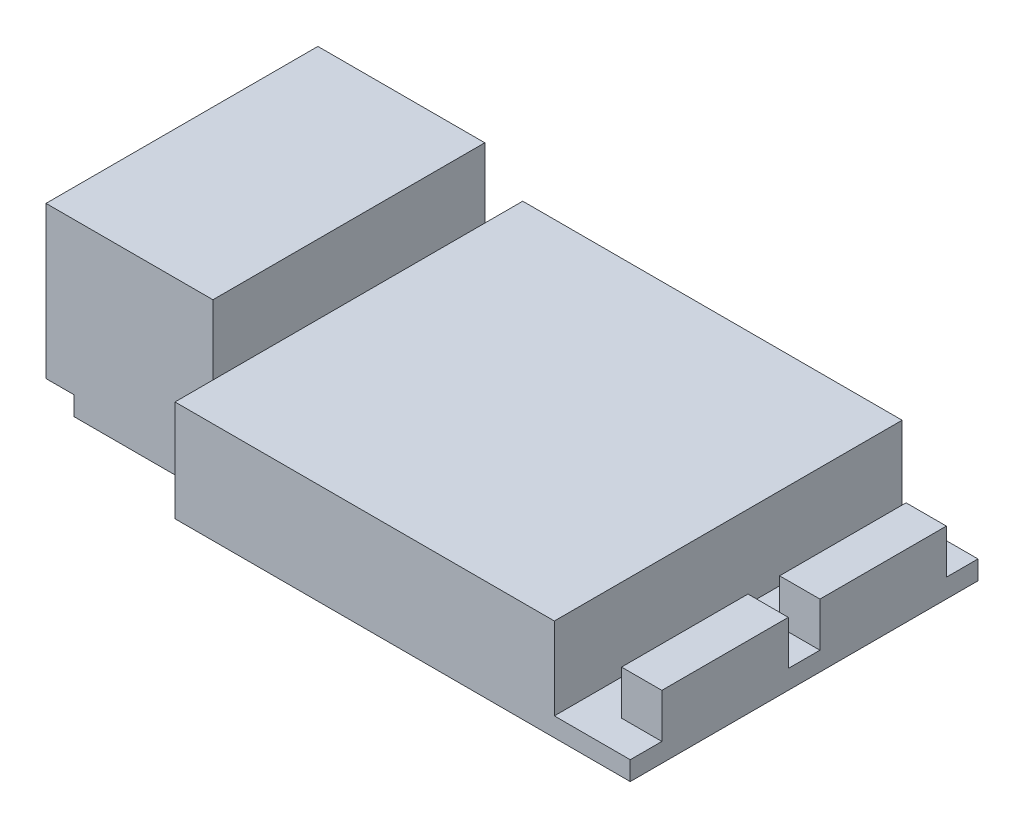
ISO-10303-21;
HEADER;
FILE_DESCRIPTION(('STEP AP214'),'2;1');
FILE_NAME('part.step','',(''),(''),'','','');
FILE_SCHEMA(('AUTOMOTIVE_DESIGN { 1 0 10303 214 1 1 1 1 }'));
ENDSEC;
DATA;
#1=APPLICATION_CONTEXT('core data for automotive mechanical design processes');
#2=APPLICATION_PROTOCOL_DEFINITION('international standard','automotive_design',2000,#1);
#3=PRODUCT_CONTEXT('',#1,'mechanical');
#4=PRODUCT('Part','Part','',(#3));
#5=PRODUCT_RELATED_PRODUCT_CATEGORY('part','',(#4));
#6=PRODUCT_DEFINITION_FORMATION('','',#4);
#7=PRODUCT_DEFINITION_CONTEXT('part definition',#1,'design');
#8=PRODUCT_DEFINITION('design','',#6,#7);
#9=PRODUCT_DEFINITION_SHAPE('','',#8);
#10=(LENGTH_UNIT() NAMED_UNIT(*) SI_UNIT(.MILLI.,.METRE.));
#11=(NAMED_UNIT(*) PLANE_ANGLE_UNIT() SI_UNIT($,.RADIAN.));
#12=(NAMED_UNIT(*) SI_UNIT($,.STERADIAN.) SOLID_ANGLE_UNIT());
#13=UNCERTAINTY_MEASURE_WITH_UNIT(LENGTH_MEASURE(1.E-05),#10,'distance_accuracy_value','');
#14=(GEOMETRIC_REPRESENTATION_CONTEXT(3) GLOBAL_UNCERTAINTY_ASSIGNED_CONTEXT((#13)) GLOBAL_UNIT_ASSIGNED_CONTEXT((#10,
#11,#12)) REPRESENTATION_CONTEXT('',''));
#15=CARTESIAN_POINT('',(0.,0.,0.));
#16=DIRECTION('',(0.,0.,1.));
#17=DIRECTION('',(1.,0.,0.));
#18=AXIS2_PLACEMENT_3D('',#15,#16,#17);
#19=CARTESIAN_POINT('',(0.,1.5,0.));
#20=DIRECTION('',(0.,-1.,0.));
#21=DIRECTION('',(0.,0.,-1.));
#22=AXIS2_PLACEMENT_3D('',#19,#20,#21);
#23=PLANE('',#22);
#24=DIRECTION('',(1.,0.,0.));
#25=VECTOR('',#24,1.);
#26=CARTESIAN_POINT('',(20.3115134769722,1.5,11.25));
#27=LINE('',#26,#25);
#28=CARTESIAN_POINT('',(20.3115134769722,1.5,11.25));
#29=VERTEX_POINT('',#28);
#30=CARTESIAN_POINT('',(23.5,1.5,11.25));
#31=VERTEX_POINT('',#30);
#32=EDGE_CURVE('E61',#29,#31,#27,.T.);
#33=ORIENTED_EDGE('',*,*,#32,.F.);
#34=DIRECTION('',(0.,0.,1.));
#35=VECTOR('',#34,1.);
#36=CARTESIAN_POINT('',(20.3115134769722,1.5,11.25));
#37=LINE('',#36,#35);
#38=CARTESIAN_POINT('',(20.3115134769722,1.5,1.25));
#39=VERTEX_POINT('',#38);
#40=EDGE_CURVE('E66',#39,#29,#37,.T.);
#41=ORIENTED_EDGE('',*,*,#40,.F.);
#42=DIRECTION('',(-1.,0.,0.));
#43=VECTOR('',#42,1.);
#44=CARTESIAN_POINT('',(20.3115134769722,1.5,1.25));
#45=LINE('',#44,#43);
#46=CARTESIAN_POINT('',(23.5,1.5,1.25));
#47=VERTEX_POINT('',#46);
#48=EDGE_CURVE('E203',#47,#39,#45,.T.);
#49=ORIENTED_EDGE('',*,*,#48,.F.);
#50=DIRECTION('',(0.,0.,-1.));
#51=VECTOR('',#50,1.);
#52=CARTESIAN_POINT('',(23.5,1.5,13.75));
#53=LINE('',#52,#51);
#54=CARTESIAN_POINT('',(23.5,1.5,-1.25));
#55=VERTEX_POINT('',#54);
#56=EDGE_CURVE('E188',#47,#55,#53,.T.);
#57=ORIENTED_EDGE('',*,*,#56,.T.);
#58=DIRECTION('',(1.,0.,0.));
#59=VECTOR('',#58,1.);
#60=CARTESIAN_POINT('',(20.3115134769722,1.5,-1.25));
#61=LINE('',#60,#59);
#62=CARTESIAN_POINT('',(20.3115134769722,1.5,-1.25));
#63=VERTEX_POINT('',#62);
#64=EDGE_CURVE('E258',#63,#55,#61,.T.);
#65=ORIENTED_EDGE('',*,*,#64,.F.);
#66=DIRECTION('',(0.,0.,1.));
#67=VECTOR('',#66,1.);
#68=CARTESIAN_POINT('',(20.3115134769722,1.5,-11.25));
#69=LINE('',#68,#67);
#70=CARTESIAN_POINT('',(20.3115134769722,1.5,-11.25));
#71=VERTEX_POINT('',#70);
#72=EDGE_CURVE('E228',#71,#63,#69,.T.);
#73=ORIENTED_EDGE('',*,*,#72,.F.);
#74=DIRECTION('',(-1.,0.,0.));
#75=VECTOR('',#74,1.);
#76=CARTESIAN_POINT('',(20.3115134769722,1.5,-11.25));
#77=LINE('',#76,#75);
#78=CARTESIAN_POINT('',(23.5,1.5,-11.25));
#79=VERTEX_POINT('',#78);
#80=EDGE_CURVE('E245',#79,#71,#77,.T.);
#81=ORIENTED_EDGE('',*,*,#80,.F.);
#82=CARTESIAN_POINT('',(23.5,1.5,-13.75));
#83=VERTEX_POINT('',#82);
#84=EDGE_CURVE('E201',#79,#83,#53,.T.);
#85=ORIENTED_EDGE('',*,*,#84,.T.);
#86=DIRECTION('',(1.,0.,0.));
#87=VECTOR('',#86,1.);
#88=CARTESIAN_POINT('',(-12.5,1.5,-13.75));
#89=LINE('',#88,#87);
#90=CARTESIAN_POINT('',(17.5,1.5,-13.75));
#91=VERTEX_POINT('',#90);
#92=EDGE_CURVE('E345',#91,#83,#89,.T.);
#93=ORIENTED_EDGE('',*,*,#92,.F.);
#94=DIRECTION('',(0.,0.,-1.));
#95=VECTOR('',#94,1.);
#96=CARTESIAN_POINT('',(17.5,1.5,-13.75));
#97=LINE('',#96,#95);
#98=CARTESIAN_POINT('',(17.5,1.5,13.75));
#99=VERTEX_POINT('',#98);
#100=EDGE_CURVE('E316',#99,#91,#97,.T.);
#101=ORIENTED_EDGE('',*,*,#100,.F.);
#102=DIRECTION('',(1.,0.,0.));
#103=VECTOR('',#102,1.);
#104=CARTESIAN_POINT('',(-12.5,1.5,13.75));
#105=LINE('',#104,#103);
#106=CARTESIAN_POINT('',(23.5,1.5,13.75));
#107=VERTEX_POINT('',#106);
#108=EDGE_CURVE('E351',#99,#107,#105,.T.);
#109=ORIENTED_EDGE('',*,*,#108,.T.);
#110=EDGE_CURVE('E200',#107,#31,#53,.T.);
#111=ORIENTED_EDGE('',*,*,#110,.T.);
#112=EDGE_LOOP('',(#33,#41,#49,#57,#65,#73,#81,#85,#93,#101,#109,#111));
#113=FACE_BOUND('',#112,.T.);
#114=ADVANCED_FACE('F43',(#113),#23,.F.);
#115=CARTESIAN_POINT('',(-12.5,1.5,10.75));
#116=DIRECTION('',(1.,0.,0.));
#117=DIRECTION('',(0.,0.,-1.));
#118=AXIS2_PLACEMENT_3D('',#115,#116,#117);
#119=PLANE('',#118);
#120=DIRECTION('',(0.,-1.,0.));
#121=VECTOR('',#120,1.);
#122=CARTESIAN_POINT('',(-12.5,1.5,-10.75));
#123=LINE('',#122,#121);
#124=CARTESIAN_POINT('',(-12.5,8.,-10.75));
#125=VERTEX_POINT('',#124);
#126=CARTESIAN_POINT('',(-12.5,0.,-10.75));
#127=VERTEX_POINT('',#126);
#128=EDGE_CURVE('E11',#125,#127,#123,.T.);
#129=ORIENTED_EDGE('',*,*,#128,.F.);
#130=DIRECTION('',(0.,0.,1.));
#131=VECTOR('',#130,1.);
#132=CARTESIAN_POINT('',(-12.5,8.,-13.75));
#133=LINE('',#132,#131);
#134=CARTESIAN_POINT('',(-12.5,8.,-13.75));
#135=VERTEX_POINT('',#134);
#136=EDGE_CURVE('E317',#135,#125,#133,.T.);
#137=ORIENTED_EDGE('',*,*,#136,.F.);
#138=DIRECTION('',(0.,-1.,0.));
#139=VECTOR('',#138,1.);
#140=CARTESIAN_POINT('',(-12.5,1.5,-13.75));
#141=LINE('',#140,#139);
#142=CARTESIAN_POINT('',(-12.5,0.,-13.75));
#143=VERTEX_POINT('',#142);
#144=EDGE_CURVE('E47',#135,#143,#141,.T.);
#145=ORIENTED_EDGE('',*,*,#144,.T.);
#146=DIRECTION('',(0.,0.,-1.));
#147=VECTOR('',#146,1.);
#148=CARTESIAN_POINT('',(-12.5,0.,-10.75));
#149=LINE('',#148,#147);
#150=EDGE_CURVE('E344',#127,#143,#149,.T.);
#151=ORIENTED_EDGE('',*,*,#150,.F.);
#152=EDGE_LOOP('',(#129,#137,#145,#151));
#153=FACE_BOUND('',#152,.T.);
#154=ADVANCED_FACE('F409',(#153),#119,.F.);
#155=CARTESIAN_POINT('',(-12.5,8.,10.75));
#156=VERTEX_POINT('',#155);
#157=CARTESIAN_POINT('',(-12.5,8.,13.75));
#158=VERTEX_POINT('',#157);
#159=EDGE_CURVE('E323',#156,#158,#133,.T.);
#160=ORIENTED_EDGE('',*,*,#159,.F.);
#161=DIRECTION('',(0.,-1.,0.));
#162=VECTOR('',#161,1.);
#163=CARTESIAN_POINT('',(-12.5,1.5,10.75));
#164=LINE('',#163,#162);
#165=CARTESIAN_POINT('',(-12.5,0.,10.75));
#166=VERTEX_POINT('',#165);
#167=EDGE_CURVE('E389',#156,#166,#164,.T.);
#168=ORIENTED_EDGE('',*,*,#167,.T.);
#169=DIRECTION('',(0.,0.,1.));
#170=VECTOR('',#169,1.);
#171=CARTESIAN_POINT('',(-12.5,0.,10.75));
#172=LINE('',#171,#170);
#173=CARTESIAN_POINT('',(-12.5,0.,13.75));
#174=VERTEX_POINT('',#173);
#175=EDGE_CURVE('E371',#166,#174,#172,.T.);
#176=ORIENTED_EDGE('',*,*,#175,.T.);
#177=DIRECTION('',(0.,-1.,0.));
#178=VECTOR('',#177,1.);
#179=CARTESIAN_POINT('',(-12.5,1.5,13.75));
#180=LINE('',#179,#178);
#181=EDGE_CURVE('E393',#158,#174,#180,.T.);
#182=ORIENTED_EDGE('',*,*,#181,.F.);
#183=EDGE_LOOP('',(#160,#168,#176,#182));
#184=FACE_BOUND('',#183,.T.);
#185=ADVANCED_FACE('F436',(#184),#119,.F.);
#186=CARTESIAN_POINT('',(-23.5,1.5,-10.75));
#187=DIRECTION('',(0.,0.,-1.));
#188=DIRECTION('',(-1.,0.,0.));
#189=AXIS2_PLACEMENT_3D('',#186,#187,#188);
#190=PLANE('',#189);
#191=DIRECTION('',(1.,0.,0.));
#192=VECTOR('',#191,1.);
#193=CARTESIAN_POINT('',(-23.5,0.,-10.75));
#194=LINE('',#193,#192);
#195=CARTESIAN_POINT('',(-23.5,0.,-10.75));
#196=VERTEX_POINT('',#195);
#197=EDGE_CURVE('E348',#196,#127,#194,.T.);
#198=ORIENTED_EDGE('',*,*,#197,.F.);
#199=DIRECTION('',(0.,-1.,0.));
#200=VECTOR('',#199,1.);
#201=CARTESIAN_POINT('',(-23.5,1.5,-10.75));
#202=LINE('',#201,#200);
#203=CARTESIAN_POINT('',(-23.5,1.5,-10.75));
#204=VERTEX_POINT('',#203);
#205=EDGE_CURVE('E53',#204,#196,#202,.T.);
#206=ORIENTED_EDGE('',*,*,#205,.F.);
#207=DIRECTION('',(-1.,0.,0.));
#208=VECTOR('',#207,1.);
#209=CARTESIAN_POINT('',(-12.5,1.5,-10.75));
#210=LINE('',#209,#208);
#211=CARTESIAN_POINT('',(-25.7,1.5,-10.75));
#212=VERTEX_POINT('',#211);
#213=EDGE_CURVE('E277',#204,#212,#210,.T.);
#214=ORIENTED_EDGE('',*,*,#213,.T.);
#215=DIRECTION('',(0.,-1.,0.));
#216=VECTOR('',#215,1.);
#217=CARTESIAN_POINT('',(-25.7,13.5,-10.75));
#218=LINE('',#217,#216);
#219=CARTESIAN_POINT('',(-25.7,13.5,-10.75));
#220=VERTEX_POINT('',#219);
#221=EDGE_CURVE('E308',#220,#212,#218,.T.);
#222=ORIENTED_EDGE('',*,*,#221,.F.);
#223=DIRECTION('',(-1.,0.,0.));
#224=VECTOR('',#223,1.);
#225=CARTESIAN_POINT('',(-12.5,13.5,-10.75));
#226=LINE('',#225,#224);
#227=CARTESIAN_POINT('',(-12.5,13.5,-10.75));
#228=VERTEX_POINT('',#227);
#229=EDGE_CURVE('E282',#228,#220,#226,.T.);
#230=ORIENTED_EDGE('',*,*,#229,.F.);
#231=DIRECTION('',(0.,-1.,0.));
#232=VECTOR('',#231,1.);
#233=CARTESIAN_POINT('',(-12.5,13.5,-10.75));
#234=LINE('',#233,#232);
#235=EDGE_CURVE('E312',#228,#125,#234,.T.);
#236=ORIENTED_EDGE('',*,*,#235,.T.);
#237=ORIENTED_EDGE('',*,*,#128,.T.);
#238=EDGE_LOOP('',(#198,#206,#214,#222,#230,#236,#237));
#239=FACE_BOUND('',#238,.T.);
#240=ADVANCED_FACE('F419',(#239),#190,.T.);
#241=CARTESIAN_POINT('',(-23.5,1.5,10.75));
#242=DIRECTION('',(-1.,0.,0.));
#243=DIRECTION('',(0.,0.,1.));
#244=AXIS2_PLACEMENT_3D('',#241,#242,#243);
#245=PLANE('',#244);
#246=DIRECTION('',(0.,0.,-1.));
#247=VECTOR('',#246,1.);
#248=CARTESIAN_POINT('',(-23.5,0.,10.75));
#249=LINE('',#248,#247);
#250=CARTESIAN_POINT('',(-23.5,0.,10.75));
#251=VERTEX_POINT('',#250);
#252=EDGE_CURVE('E377',#251,#196,#249,.T.);
#253=ORIENTED_EDGE('',*,*,#252,.F.);
#254=DIRECTION('',(0.,-1.,0.));
#255=VECTOR('',#254,1.);
#256=CARTESIAN_POINT('',(-23.5,1.5,10.75));
#257=LINE('',#256,#255);
#258=CARTESIAN_POINT('',(-23.5,1.5,10.75));
#259=VERTEX_POINT('',#258);
#260=EDGE_CURVE('E386',#259,#251,#257,.T.);
#261=ORIENTED_EDGE('',*,*,#260,.F.);
#262=DIRECTION('',(0.,0.,-1.));
#263=VECTOR('',#262,1.);
#264=CARTESIAN_POINT('',(-23.5,1.5,10.75));
#265=LINE('',#264,#263);
#266=EDGE_CURVE('E354',#259,#204,#265,.T.);
#267=ORIENTED_EDGE('',*,*,#266,.T.);
#268=ORIENTED_EDGE('',*,*,#205,.T.);
#269=EDGE_LOOP('',(#253,#261,#267,#268));
#270=FACE_BOUND('',#269,.T.);
#271=ADVANCED_FACE('F480',(#270),#245,.T.);
#272=CARTESIAN_POINT('',(-23.5,1.5,10.75));
#273=DIRECTION('',(0.,0.,-1.));
#274=DIRECTION('',(-1.,0.,0.));
#275=AXIS2_PLACEMENT_3D('',#272,#273,#274);
#276=PLANE('',#275);
#277=DIRECTION('',(1.,0.,0.));
#278=VECTOR('',#277,1.);
#279=CARTESIAN_POINT('',(-23.5,0.,10.75));
#280=LINE('',#279,#278);
#281=EDGE_CURVE('E374',#251,#166,#280,.T.);
#282=ORIENTED_EDGE('',*,*,#281,.T.);
#283=ORIENTED_EDGE('',*,*,#167,.F.);
#284=DIRECTION('',(0.,-1.,0.));
#285=VECTOR('',#284,1.);
#286=CARTESIAN_POINT('',(-12.5,13.5,10.75));
#287=LINE('',#286,#285);
#288=CARTESIAN_POINT('',(-12.5,13.5,10.75));
#289=VERTEX_POINT('',#288);
#290=EDGE_CURVE('E292',#289,#156,#287,.T.);
#291=ORIENTED_EDGE('',*,*,#290,.F.);
#292=DIRECTION('',(1.,0.,0.));
#293=VECTOR('',#292,1.);
#294=CARTESIAN_POINT('',(-12.5,13.5,10.75));
#295=LINE('',#294,#293);
#296=CARTESIAN_POINT('',(-25.7,13.5,10.75));
#297=VERTEX_POINT('',#296);
#298=EDGE_CURVE('E289',#297,#289,#295,.T.);
#299=ORIENTED_EDGE('',*,*,#298,.F.);
#300=DIRECTION('',(0.,-1.,0.));
#301=VECTOR('',#300,1.);
#302=CARTESIAN_POINT('',(-25.7,13.5,10.75));
#303=LINE('',#302,#301);
#304=CARTESIAN_POINT('',(-25.7,1.5,10.75));
#305=VERTEX_POINT('',#304);
#306=EDGE_CURVE('E304',#297,#305,#303,.T.);
#307=ORIENTED_EDGE('',*,*,#306,.T.);
#308=DIRECTION('',(1.,0.,0.));
#309=VECTOR('',#308,1.);
#310=CARTESIAN_POINT('',(-12.5,1.5,10.75));
#311=LINE('',#310,#309);
#312=EDGE_CURVE('E283',#305,#259,#311,.T.);
#313=ORIENTED_EDGE('',*,*,#312,.T.);
#314=ORIENTED_EDGE('',*,*,#260,.T.);
#315=EDGE_LOOP('',(#282,#283,#291,#299,#307,#313,#314));
#316=FACE_BOUND('',#315,.T.);
#317=ADVANCED_FACE('F483',(#316),#276,.F.);
#318=CARTESIAN_POINT('',(-12.5,1.5,13.75));
#319=DIRECTION('',(0.,0.,-1.));
#320=DIRECTION('',(-1.,0.,0.));
#321=AXIS2_PLACEMENT_3D('',#318,#319,#320);
#322=PLANE('',#321);
#323=DIRECTION('',(1.,0.,0.));
#324=VECTOR('',#323,1.);
#325=CARTESIAN_POINT('',(-12.5,0.,13.75));
#326=LINE('',#325,#324);
#327=CARTESIAN_POINT('',(23.5,0.,13.75));
#328=VERTEX_POINT('',#327);
#329=EDGE_CURVE('E368',#174,#328,#326,.T.);
#330=ORIENTED_EDGE('',*,*,#329,.T.);
#331=DIRECTION('',(0.,-1.,0.));
#332=VECTOR('',#331,1.);
#333=CARTESIAN_POINT('',(23.5,1.5,13.75));
#334=LINE('',#333,#332);
#335=EDGE_CURVE('E397',#107,#328,#334,.T.);
#336=ORIENTED_EDGE('',*,*,#335,.F.);
#337=ORIENTED_EDGE('',*,*,#108,.F.);
#338=DIRECTION('',(0.,-1.,0.));
#339=VECTOR('',#338,1.);
#340=CARTESIAN_POINT('',(17.5,8.,13.75));
#341=LINE('',#340,#339);
#342=CARTESIAN_POINT('',(17.5,8.,13.75));
#343=VERTEX_POINT('',#342);
#344=EDGE_CURVE('E340',#343,#99,#341,.T.);
#345=ORIENTED_EDGE('',*,*,#344,.F.);
#346=DIRECTION('',(1.,0.,0.));
#347=VECTOR('',#346,1.);
#348=CARTESIAN_POINT('',(-12.5,8.,13.75));
#349=LINE('',#348,#347);
#350=EDGE_CURVE('E321',#158,#343,#349,.T.);
#351=ORIENTED_EDGE('',*,*,#350,.F.);
#352=ORIENTED_EDGE('',*,*,#181,.T.);
#353=EDGE_LOOP('',(#330,#336,#337,#345,#351,#352));
#354=FACE_BOUND('',#353,.T.);
#355=ADVANCED_FACE('F440',(#354),#322,.F.);
#356=CARTESIAN_POINT('',(23.5,1.5,13.75));
#357=DIRECTION('',(-1.,0.,0.));
#358=DIRECTION('',(0.,0.,1.));
#359=AXIS2_PLACEMENT_3D('',#356,#357,#358);
#360=PLANE('',#359);
#361=DIRECTION('',(0.,0.,-1.));
#362=VECTOR('',#361,1.);
#363=CARTESIAN_POINT('',(23.5,0.,13.75));
#364=LINE('',#363,#362);
#365=CARTESIAN_POINT('',(23.5,0.,-13.75));
#366=VERTEX_POINT('',#365);
#367=EDGE_CURVE('E365',#328,#366,#364,.T.);
#368=ORIENTED_EDGE('',*,*,#367,.T.);
#369=DIRECTION('',(0.,-1.,0.));
#370=VECTOR('',#369,1.);
#371=CARTESIAN_POINT('',(23.5,1.5,-13.75));
#372=LINE('',#371,#370);
#373=EDGE_CURVE('E400',#83,#366,#372,.T.);
#374=ORIENTED_EDGE('',*,*,#373,.F.);
#375=ORIENTED_EDGE('',*,*,#84,.F.);
#376=DIRECTION('',(0.,-1.,0.));
#377=VECTOR('',#376,1.);
#378=CARTESIAN_POINT('',(23.5,5.,-11.25));
#379=LINE('',#378,#377);
#380=CARTESIAN_POINT('',(23.5,5.,-11.25));
#381=VERTEX_POINT('',#380);
#382=EDGE_CURVE('E267',#381,#79,#379,.T.);
#383=ORIENTED_EDGE('',*,*,#382,.F.);
#384=DIRECTION('',(0.,0.,-1.));
#385=VECTOR('',#384,1.);
#386=CARTESIAN_POINT('',(23.5,5.,-11.25));
#387=LINE('',#386,#385);
#388=CARTESIAN_POINT('',(23.5,5.,-1.25));
#389=VERTEX_POINT('',#388);
#390=EDGE_CURVE('E248',#389,#381,#387,.T.);
#391=ORIENTED_EDGE('',*,*,#390,.F.);
#392=DIRECTION('',(0.,-1.,0.));
#393=VECTOR('',#392,1.);
#394=CARTESIAN_POINT('',(23.5,5.,-1.25));
#395=LINE('',#394,#393);
#396=EDGE_CURVE('E197',#389,#55,#395,.T.);
#397=ORIENTED_EDGE('',*,*,#396,.T.);
#398=ORIENTED_EDGE('',*,*,#56,.F.);
#399=DIRECTION('',(0.,-1.,0.));
#400=VECTOR('',#399,1.);
#401=CARTESIAN_POINT('',(23.5,5.,1.25));
#402=LINE('',#401,#400);
#403=CARTESIAN_POINT('',(23.5,5.,1.25));
#404=VERTEX_POINT('',#403);
#405=EDGE_CURVE('E193',#404,#47,#402,.T.);
#406=ORIENTED_EDGE('',*,*,#405,.F.);
#407=DIRECTION('',(0.,0.,-1.));
#408=VECTOR('',#407,1.);
#409=CARTESIAN_POINT('',(23.5,5.,11.25));
#410=LINE('',#409,#408);
#411=CARTESIAN_POINT('',(23.5,5.,11.25));
#412=VERTEX_POINT('',#411);
#413=EDGE_CURVE('E231',#412,#404,#410,.T.);
#414=ORIENTED_EDGE('',*,*,#413,.F.);
#415=DIRECTION('',(0.,-1.,0.));
#416=VECTOR('',#415,1.);
#417=CARTESIAN_POINT('',(23.5,5.,11.25));
#418=LINE('',#417,#416);
#419=EDGE_CURVE('E214',#412,#31,#418,.T.);
#420=ORIENTED_EDGE('',*,*,#419,.T.);
#421=ORIENTED_EDGE('',*,*,#110,.F.);
#422=ORIENTED_EDGE('',*,*,#335,.T.);
#423=EDGE_LOOP('',(#368,#374,#375,#383,#391,#397,#398,#406,#414,#420,#421,#422));
#424=FACE_BOUND('',#423,.T.);
#425=ADVANCED_FACE('F190',(#424),#360,.F.);
#426=CARTESIAN_POINT('',(-12.5,1.5,-13.75));
#427=DIRECTION('',(0.,0.,-1.));
#428=DIRECTION('',(-1.,0.,0.));
#429=AXIS2_PLACEMENT_3D('',#426,#427,#428);
#430=PLANE('',#429);
#431=DIRECTION('',(1.,0.,0.));
#432=VECTOR('',#431,1.);
#433=CARTESIAN_POINT('',(-12.5,0.,-13.75));
#434=LINE('',#433,#432);
#435=EDGE_CURVE('E361',#143,#366,#434,.T.);
#436=ORIENTED_EDGE('',*,*,#435,.F.);
#437=ORIENTED_EDGE('',*,*,#144,.F.);
#438=DIRECTION('',(-1.,0.,0.));
#439=VECTOR('',#438,1.);
#440=CARTESIAN_POINT('',(-12.5,8.,-13.75));
#441=LINE('',#440,#439);
#442=CARTESIAN_POINT('',(17.5,8.,-13.75));
#443=VERTEX_POINT('',#442);
#444=EDGE_CURVE('E329',#443,#135,#441,.T.);
#445=ORIENTED_EDGE('',*,*,#444,.F.);
#446=DIRECTION('',(0.,-1.,0.));
#447=VECTOR('',#446,1.);
#448=CARTESIAN_POINT('',(17.5,8.,-13.75));
#449=LINE('',#448,#447);
#450=EDGE_CURVE('E333',#443,#91,#449,.T.);
#451=ORIENTED_EDGE('',*,*,#450,.T.);
#452=ORIENTED_EDGE('',*,*,#92,.T.);
#453=ORIENTED_EDGE('',*,*,#373,.T.);
#454=EDGE_LOOP('',(#436,#437,#445,#451,#452,#453));
#455=FACE_BOUND('',#454,.T.);
#456=ADVANCED_FACE('F45',(#455),#430,.T.);
#457=CARTESIAN_POINT('',(0.,0.,0.));
#458=DIRECTION('',(0.,-1.,0.));
#459=DIRECTION('',(0.,0.,-1.));
#460=AXIS2_PLACEMENT_3D('',#457,#458,#459);
#461=PLANE('',#460);
#462=ORIENTED_EDGE('',*,*,#150,.T.);
#463=ORIENTED_EDGE('',*,*,#435,.T.);
#464=ORIENTED_EDGE('',*,*,#367,.F.);
#465=ORIENTED_EDGE('',*,*,#329,.F.);
#466=ORIENTED_EDGE('',*,*,#175,.F.);
#467=ORIENTED_EDGE('',*,*,#281,.F.);
#468=ORIENTED_EDGE('',*,*,#252,.T.);
#469=ORIENTED_EDGE('',*,*,#197,.T.);
#470=EDGE_LOOP('',(#462,#463,#464,#465,#466,#467,#468,#469));
#471=FACE_BOUND('',#470,.T.);
#472=ADVANCED_FACE('F413',(#471),#461,.T.);
#473=CARTESIAN_POINT('',(17.5,8.,-13.75));
#474=DIRECTION('',(-1.,0.,0.));
#475=DIRECTION('',(0.,0.,1.));
#476=AXIS2_PLACEMENT_3D('',#473,#474,#475);
#477=PLANE('',#476);
#478=ORIENTED_EDGE('',*,*,#100,.T.);
#479=ORIENTED_EDGE('',*,*,#450,.F.);
#480=DIRECTION('',(0.,0.,-1.));
#481=VECTOR('',#480,1.);
#482=CARTESIAN_POINT('',(17.5,8.,-13.75));
#483=LINE('',#482,#481);
#484=EDGE_CURVE('E326',#343,#443,#483,.T.);
#485=ORIENTED_EDGE('',*,*,#484,.F.);
#486=ORIENTED_EDGE('',*,*,#344,.T.);
#487=EDGE_LOOP('',(#478,#479,#485,#486));
#488=FACE_BOUND('',#487,.T.);
#489=ADVANCED_FACE('F446',(#488),#477,.F.);
#490=CARTESIAN_POINT('',(0.,8.,0.));
#491=DIRECTION('',(0.,1.,0.));
#492=DIRECTION('',(0.,0.,1.));
#493=AXIS2_PLACEMENT_3D('',#490,#491,#492);
#494=PLANE('',#493);
#495=ORIENTED_EDGE('',*,*,#136,.T.);
#496=EDGE_CURVE('E322',#125,#156,#133,.T.);
#497=ORIENTED_EDGE('',*,*,#496,.T.);
#498=ORIENTED_EDGE('',*,*,#159,.T.);
#499=ORIENTED_EDGE('',*,*,#350,.T.);
#500=ORIENTED_EDGE('',*,*,#484,.T.);
#501=ORIENTED_EDGE('',*,*,#444,.T.);
#502=EDGE_LOOP('',(#495,#497,#498,#499,#500,#501));
#503=FACE_BOUND('',#502,.T.);
#504=ADVANCED_FACE('F432',(#503),#494,.T.);
#505=CARTESIAN_POINT('',(-12.5,13.5,-10.75));
#506=DIRECTION('',(-1.,0.,0.));
#507=DIRECTION('',(0.,0.,1.));
#508=AXIS2_PLACEMENT_3D('',#505,#506,#507);
#509=PLANE('',#508);
#510=ORIENTED_EDGE('',*,*,#496,.F.);
#511=ORIENTED_EDGE('',*,*,#235,.F.);
#512=DIRECTION('',(0.,0.,-1.));
#513=VECTOR('',#512,1.);
#514=CARTESIAN_POINT('',(-12.5,13.5,-10.75));
#515=LINE('',#514,#513);
#516=EDGE_CURVE('E278',#289,#228,#515,.T.);
#517=ORIENTED_EDGE('',*,*,#516,.F.);
#518=ORIENTED_EDGE('',*,*,#290,.T.);
#519=EDGE_LOOP('',(#510,#511,#517,#518));
#520=FACE_BOUND('',#519,.T.);
#521=ADVANCED_FACE('F424',(#520),#509,.F.);
#522=CARTESIAN_POINT('',(-25.7,13.5,-10.75));
#523=DIRECTION('',(1.,0.,0.));
#524=DIRECTION('',(0.,0.,-1.));
#525=AXIS2_PLACEMENT_3D('',#522,#523,#524);
#526=PLANE('',#525);
#527=DIRECTION('',(0.,0.,1.));
#528=VECTOR('',#527,1.);
#529=CARTESIAN_POINT('',(-25.7,1.5,-10.75));
#530=LINE('',#529,#528);
#531=EDGE_CURVE('E295',#212,#305,#530,.T.);
#532=ORIENTED_EDGE('',*,*,#531,.T.);
#533=ORIENTED_EDGE('',*,*,#306,.F.);
#534=DIRECTION('',(0.,0.,1.));
#535=VECTOR('',#534,1.);
#536=CARTESIAN_POINT('',(-25.7,13.5,-10.75));
#537=LINE('',#536,#535);
#538=EDGE_CURVE('E286',#220,#297,#537,.T.);
#539=ORIENTED_EDGE('',*,*,#538,.F.);
#540=ORIENTED_EDGE('',*,*,#221,.T.);
#541=EDGE_LOOP('',(#532,#533,#539,#540));
#542=FACE_BOUND('',#541,.T.);
#543=ADVANCED_FACE('F518',(#542),#526,.F.);
#544=CARTESIAN_POINT('',(0.,13.5,0.));
#545=DIRECTION('',(0.,-1.,0.));
#546=DIRECTION('',(0.,0.,-1.));
#547=AXIS2_PLACEMENT_3D('',#544,#545,#546);
#548=PLANE('',#547);
#549=ORIENTED_EDGE('',*,*,#516,.T.);
#550=ORIENTED_EDGE('',*,*,#229,.T.);
#551=ORIENTED_EDGE('',*,*,#538,.T.);
#552=ORIENTED_EDGE('',*,*,#298,.T.);
#553=EDGE_LOOP('',(#549,#550,#551,#552));
#554=FACE_BOUND('',#553,.T.);
#555=ADVANCED_FACE('F525',(#554),#548,.F.);
#556=CARTESIAN_POINT('',(0.,1.5,0.));
#557=DIRECTION('',(0.,-1.,0.));
#558=DIRECTION('',(0.,0.,-1.));
#559=AXIS2_PLACEMENT_3D('',#556,#557,#558);
#560=PLANE('',#559);
#561=ORIENTED_EDGE('',*,*,#213,.F.);
#562=ORIENTED_EDGE('',*,*,#266,.F.);
#563=ORIENTED_EDGE('',*,*,#312,.F.);
#564=ORIENTED_EDGE('',*,*,#531,.F.);
#565=EDGE_LOOP('',(#561,#562,#563,#564));
#566=FACE_BOUND('',#565,.T.);
#567=ADVANCED_FACE('F533',(#566),#560,.T.);
#568=CARTESIAN_POINT('',(20.3115134769722,5.,-11.25));
#569=DIRECTION('',(1.,0.,0.));
#570=DIRECTION('',(0.,0.,-1.));
#571=AXIS2_PLACEMENT_3D('',#568,#569,#570);
#572=PLANE('',#571);
#573=ORIENTED_EDGE('',*,*,#72,.T.);
#574=DIRECTION('',(0.,-1.,0.));
#575=VECTOR('',#574,1.);
#576=CARTESIAN_POINT('',(20.3115134769722,5.,-1.25));
#577=LINE('',#576,#575);
#578=CARTESIAN_POINT('',(20.3115134769722,5.,-1.25));
#579=VERTEX_POINT('',#578);
#580=EDGE_CURVE('E273',#579,#63,#577,.T.);
#581=ORIENTED_EDGE('',*,*,#580,.F.);
#582=DIRECTION('',(0.,0.,1.));
#583=VECTOR('',#582,1.);
#584=CARTESIAN_POINT('',(20.3115134769722,5.,-11.25));
#585=LINE('',#584,#583);
#586=CARTESIAN_POINT('',(20.3115134769722,5.,-11.25));
#587=VERTEX_POINT('',#586);
#588=EDGE_CURVE('E240',#587,#579,#585,.T.);
#589=ORIENTED_EDGE('',*,*,#588,.F.);
#590=DIRECTION('',(0.,-1.,0.));
#591=VECTOR('',#590,1.);
#592=CARTESIAN_POINT('',(20.3115134769722,5.,-11.25));
#593=LINE('',#592,#591);
#594=EDGE_CURVE('E254',#587,#71,#593,.T.);
#595=ORIENTED_EDGE('',*,*,#594,.T.);
#596=EDGE_LOOP('',(#573,#581,#589,#595));
#597=FACE_BOUND('',#596,.T.);
#598=ADVANCED_FACE('F541',(#597),#572,.F.);
#599=CARTESIAN_POINT('',(20.3115134769722,5.,-1.25));
#600=DIRECTION('',(0.,0.,-1.));
#601=DIRECTION('',(-1.,0.,0.));
#602=AXIS2_PLACEMENT_3D('',#599,#600,#601);
#603=PLANE('',#602);
#604=ORIENTED_EDGE('',*,*,#64,.T.);
#605=ORIENTED_EDGE('',*,*,#396,.F.);
#606=DIRECTION('',(1.,0.,0.));
#607=VECTOR('',#606,1.);
#608=CARTESIAN_POINT('',(20.3115134769722,5.,-1.25));
#609=LINE('',#608,#607);
#610=EDGE_CURVE('E244',#579,#389,#609,.T.);
#611=ORIENTED_EDGE('',*,*,#610,.F.);
#612=ORIENTED_EDGE('',*,*,#580,.T.);
#613=EDGE_LOOP('',(#604,#605,#611,#612));
#614=FACE_BOUND('',#613,.T.);
#615=ADVANCED_FACE('F549',(#614),#603,.F.);
#616=CARTESIAN_POINT('',(20.3115134769722,5.,-11.25));
#617=DIRECTION('',(0.,0.,1.));
#618=DIRECTION('',(1.,0.,0.));
#619=AXIS2_PLACEMENT_3D('',#616,#617,#618);
#620=PLANE('',#619);
#621=ORIENTED_EDGE('',*,*,#80,.T.);
#622=ORIENTED_EDGE('',*,*,#594,.F.);
#623=DIRECTION('',(-1.,0.,0.));
#624=VECTOR('',#623,1.);
#625=CARTESIAN_POINT('',(20.3115134769722,5.,-11.25));
#626=LINE('',#625,#624);
#627=EDGE_CURVE('E251',#381,#587,#626,.T.);
#628=ORIENTED_EDGE('',*,*,#627,.F.);
#629=ORIENTED_EDGE('',*,*,#382,.T.);
#630=EDGE_LOOP('',(#621,#622,#628,#629));
#631=FACE_BOUND('',#630,.T.);
#632=ADVANCED_FACE('F557',(#631),#620,.F.);
#633=CARTESIAN_POINT('',(0.,5.,0.));
#634=DIRECTION('',(0.,1.,0.));
#635=DIRECTION('',(0.,0.,1.));
#636=AXIS2_PLACEMENT_3D('',#633,#634,#635);
#637=PLANE('',#636);
#638=ORIENTED_EDGE('',*,*,#588,.T.);
#639=ORIENTED_EDGE('',*,*,#610,.T.);
#640=ORIENTED_EDGE('',*,*,#390,.T.);
#641=ORIENTED_EDGE('',*,*,#627,.T.);
#642=EDGE_LOOP('',(#638,#639,#640,#641));
#643=FACE_BOUND('',#642,.T.);
#644=ADVANCED_FACE('F565',(#643),#637,.T.);
#645=CARTESIAN_POINT('',(20.3115134769722,5.,11.25));
#646=DIRECTION('',(1.,0.,0.));
#647=DIRECTION('',(0.,0.,-1.));
#648=AXIS2_PLACEMENT_3D('',#645,#646,#647);
#649=PLANE('',#648);
#650=ORIENTED_EDGE('',*,*,#40,.T.);
#651=DIRECTION('',(0.,-1.,0.));
#652=VECTOR('',#651,1.);
#653=CARTESIAN_POINT('',(20.3115134769722,5.,11.25));
#654=LINE('',#653,#652);
#655=CARTESIAN_POINT('',(20.3115134769722,5.,11.25));
#656=VERTEX_POINT('',#655);
#657=EDGE_CURVE('E220',#656,#29,#654,.T.);
#658=ORIENTED_EDGE('',*,*,#657,.F.);
#659=DIRECTION('',(0.,0.,1.));
#660=VECTOR('',#659,1.);
#661=CARTESIAN_POINT('',(20.3115134769722,5.,11.25));
#662=LINE('',#661,#660);
#663=CARTESIAN_POINT('',(20.3115134769722,5.,1.25));
#664=VERTEX_POINT('',#663);
#665=EDGE_CURVE('E208',#664,#656,#662,.T.);
#666=ORIENTED_EDGE('',*,*,#665,.F.);
#667=DIRECTION('',(0.,-1.,0.));
#668=VECTOR('',#667,1.);
#669=CARTESIAN_POINT('',(20.3115134769722,5.,1.25));
#670=LINE('',#669,#668);
#671=EDGE_CURVE('E213',#664,#39,#670,.T.);
#672=ORIENTED_EDGE('',*,*,#671,.T.);
#673=EDGE_LOOP('',(#650,#658,#666,#672));
#674=FACE_BOUND('',#673,.T.);
#675=ADVANCED_FACE('F457',(#674),#649,.F.);
#676=CARTESIAN_POINT('',(20.3115134769722,5.,11.25));
#677=DIRECTION('',(0.,0.,-1.));
#678=DIRECTION('',(-1.,0.,0.));
#679=AXIS2_PLACEMENT_3D('',#676,#677,#678);
#680=PLANE('',#679);
#681=ORIENTED_EDGE('',*,*,#32,.T.);
#682=ORIENTED_EDGE('',*,*,#419,.F.);
#683=DIRECTION('',(1.,0.,0.));
#684=VECTOR('',#683,1.);
#685=CARTESIAN_POINT('',(20.3115134769722,5.,11.25));
#686=LINE('',#685,#684);
#687=EDGE_CURVE('E234',#656,#412,#686,.T.);
#688=ORIENTED_EDGE('',*,*,#687,.F.);
#689=ORIENTED_EDGE('',*,*,#657,.T.);
#690=EDGE_LOOP('',(#681,#682,#688,#689));
#691=FACE_BOUND('',#690,.T.);
#692=ADVANCED_FACE('F452',(#691),#680,.F.);
#693=CARTESIAN_POINT('',(20.3115134769722,5.,1.25));
#694=DIRECTION('',(0.,0.,1.));
#695=DIRECTION('',(1.,0.,0.));
#696=AXIS2_PLACEMENT_3D('',#693,#694,#695);
#697=PLANE('',#696);
#698=ORIENTED_EDGE('',*,*,#48,.T.);
#699=ORIENTED_EDGE('',*,*,#671,.F.);
#700=DIRECTION('',(-1.,0.,0.));
#701=VECTOR('',#700,1.);
#702=CARTESIAN_POINT('',(20.3115134769722,5.,1.25));
#703=LINE('',#702,#701);
#704=EDGE_CURVE('E211',#404,#664,#703,.T.);
#705=ORIENTED_EDGE('',*,*,#704,.F.);
#706=ORIENTED_EDGE('',*,*,#405,.T.);
#707=EDGE_LOOP('',(#698,#699,#705,#706));
#708=FACE_BOUND('',#707,.T.);
#709=ADVANCED_FACE('F210',(#708),#697,.F.);
#710=CARTESIAN_POINT('',(0.,5.,0.));
#711=DIRECTION('',(0.,-1.,0.));
#712=DIRECTION('',(0.,0.,-1.));
#713=AXIS2_PLACEMENT_3D('',#710,#711,#712);
#714=PLANE('',#713);
#715=ORIENTED_EDGE('',*,*,#665,.T.);
#716=ORIENTED_EDGE('',*,*,#687,.T.);
#717=ORIENTED_EDGE('',*,*,#413,.T.);
#718=ORIENTED_EDGE('',*,*,#704,.T.);
#719=EDGE_LOOP('',(#715,#716,#717,#718));
#720=FACE_BOUND('',#719,.T.);
#721=ADVANCED_FACE('F459',(#720),#714,.F.);
#722=CLOSED_SHELL('',(#114,#154,#185,#240,#271,#317,#355,#425,#456,#472,#489,#504,#521,#543,
#555,#567,#598,#615,#632,#644,#675,#692,#709,#721));
#723=MANIFOLD_SOLID_BREP('B2',#722);
#724=ADVANCED_BREP_SHAPE_REPRESENTATION('',(#18,#723),#14);
#725=SHAPE_DEFINITION_REPRESENTATION(#9,#724);
ENDSEC;
END-ISO-10303-21;
